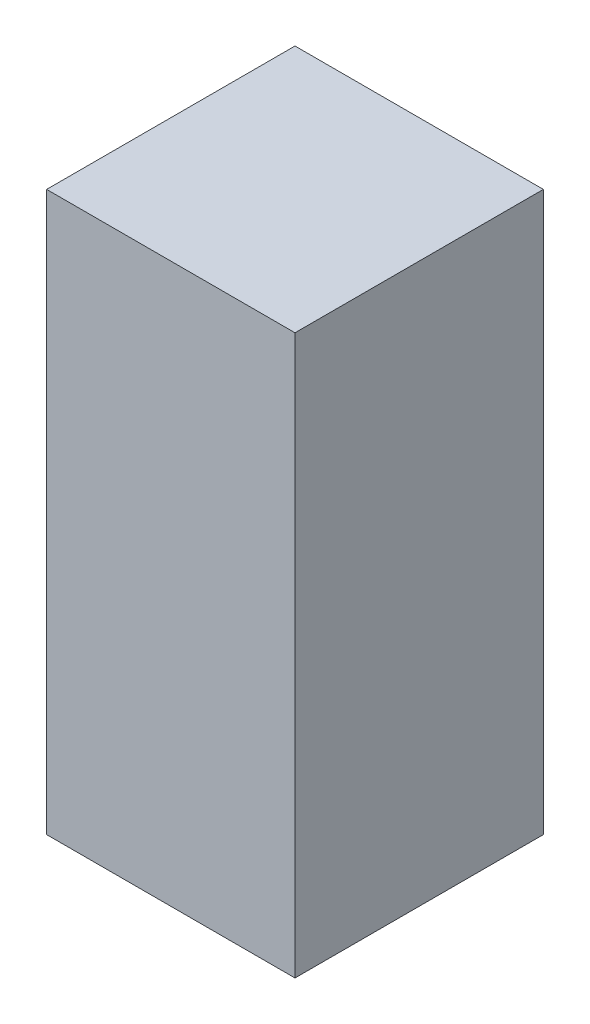
ISO-10303-21;
HEADER;
FILE_DESCRIPTION(('STEP AP214'),'2;1');
FILE_NAME('part.step','',(''),(''),'','','');
FILE_SCHEMA(('AUTOMOTIVE_DESIGN { 1 0 10303 214 1 1 1 1 }'));
ENDSEC;
DATA;
#1=APPLICATION_CONTEXT('core data for automotive mechanical design processes');
#2=APPLICATION_PROTOCOL_DEFINITION('international standard','automotive_design',2000,#1);
#3=PRODUCT_CONTEXT('',#1,'mechanical');
#4=PRODUCT('Part','Part','',(#3));
#5=PRODUCT_RELATED_PRODUCT_CATEGORY('part','',(#4));
#6=PRODUCT_DEFINITION_FORMATION('','',#4);
#7=PRODUCT_DEFINITION_CONTEXT('part definition',#1,'design');
#8=PRODUCT_DEFINITION('design','',#6,#7);
#9=PRODUCT_DEFINITION_SHAPE('','',#8);
#10=(LENGTH_UNIT() NAMED_UNIT(*) SI_UNIT(.MILLI.,.METRE.));
#11=(NAMED_UNIT(*) PLANE_ANGLE_UNIT() SI_UNIT($,.RADIAN.));
#12=(NAMED_UNIT(*) SI_UNIT($,.STERADIAN.) SOLID_ANGLE_UNIT());
#13=UNCERTAINTY_MEASURE_WITH_UNIT(LENGTH_MEASURE(1.E-05),#10,'distance_accuracy_value','');
#14=(GEOMETRIC_REPRESENTATION_CONTEXT(3) GLOBAL_UNCERTAINTY_ASSIGNED_CONTEXT((#13)) GLOBAL_UNIT_ASSIGNED_CONTEXT((#10,
#11,#12)) REPRESENTATION_CONTEXT('',''));
#15=CARTESIAN_POINT('',(0.,0.,0.));
#16=DIRECTION('',(0.,0.,1.));
#17=DIRECTION('',(1.,0.,0.));
#18=AXIS2_PLACEMENT_3D('',#15,#16,#17);
#19=CARTESIAN_POINT('',(177.5,552.,-572.5));
#20=DIRECTION('',(-1.,0.,0.));
#21=DIRECTION('',(0.,0.,1.));
#22=AXIS2_PLACEMENT_3D('',#19,#20,#21);
#23=PLANE('',#22);
#24=DIRECTION('',(0.,-1.,0.));
#25=VECTOR('',#24,1.);
#26=CARTESIAN_POINT('',(177.5,552.,-552.5));
#27=LINE('',#26,#25);
#28=CARTESIAN_POINT('',(177.5,597.,-552.5));
#29=VERTEX_POINT('',#28);
#30=CARTESIAN_POINT('',(177.5,552.,-552.5));
#31=VERTEX_POINT('',#30);
#32=EDGE_CURVE('E103',#29,#31,#27,.T.);
#33=ORIENTED_EDGE('',*,*,#32,.F.);
#34=DIRECTION('',(0.,0.,1.));
#35=VECTOR('',#34,1.);
#36=CARTESIAN_POINT('',(177.5,597.,-572.5));
#37=LINE('',#36,#35);
#38=CARTESIAN_POINT('',(177.5,597.,-572.5));
#39=VERTEX_POINT('',#38);
#40=EDGE_CURVE('E11',#39,#29,#37,.T.);
#41=ORIENTED_EDGE('',*,*,#40,.F.);
#42=DIRECTION('',(0.,-1.,0.));
#43=VECTOR('',#42,1.);
#44=CARTESIAN_POINT('',(177.5,552.,-572.5));
#45=LINE('',#44,#43);
#46=CARTESIAN_POINT('',(177.5,552.,-572.5));
#47=VERTEX_POINT('',#46);
#48=EDGE_CURVE('E97',#39,#47,#45,.T.);
#49=ORIENTED_EDGE('',*,*,#48,.T.);
#50=DIRECTION('',(0.,0.,1.));
#51=VECTOR('',#50,1.);
#52=CARTESIAN_POINT('',(177.5,552.,-572.5));
#53=LINE('',#52,#51);
#54=EDGE_CURVE('E42',#47,#31,#53,.T.);
#55=ORIENTED_EDGE('',*,*,#54,.T.);
#56=EDGE_LOOP('',(#33,#41,#49,#55));
#57=FACE_BOUND('',#56,.T.);
#58=ADVANCED_FACE('F39',(#57),#23,.T.);
#59=CARTESIAN_POINT('',(177.5,597.,-572.5));
#60=DIRECTION('',(0.,1.,0.));
#61=DIRECTION('',(0.,0.,1.));
#62=AXIS2_PLACEMENT_3D('',#59,#60,#61);
#63=PLANE('',#62);
#64=DIRECTION('',(-1.,0.,0.));
#65=VECTOR('',#64,1.);
#66=CARTESIAN_POINT('',(177.5,597.,-552.5));
#67=LINE('',#66,#65);
#68=CARTESIAN_POINT('',(197.5,597.,-552.5));
#69=VERTEX_POINT('',#68);
#70=EDGE_CURVE('E99',#69,#29,#67,.T.);
#71=ORIENTED_EDGE('',*,*,#70,.F.);
#72=DIRECTION('',(0.,0.,1.));
#73=VECTOR('',#72,1.);
#74=CARTESIAN_POINT('',(197.5,597.,-572.5));
#75=LINE('',#74,#73);
#76=CARTESIAN_POINT('',(197.5,597.,-572.5));
#77=VERTEX_POINT('',#76);
#78=EDGE_CURVE('E48',#77,#69,#75,.T.);
#79=ORIENTED_EDGE('',*,*,#78,.F.);
#80=DIRECTION('',(-1.,0.,0.));
#81=VECTOR('',#80,1.);
#82=CARTESIAN_POINT('',(177.5,597.,-572.5));
#83=LINE('',#82,#81);
#84=EDGE_CURVE('E94',#77,#39,#83,.T.);
#85=ORIENTED_EDGE('',*,*,#84,.T.);
#86=ORIENTED_EDGE('',*,*,#40,.T.);
#87=EDGE_LOOP('',(#71,#79,#85,#86));
#88=FACE_BOUND('',#87,.T.);
#89=ADVANCED_FACE('F113',(#88),#63,.T.);
#90=CARTESIAN_POINT('',(197.5,552.,-572.5));
#91=DIRECTION('',(1.,0.,0.));
#92=DIRECTION('',(0.,0.,-1.));
#93=AXIS2_PLACEMENT_3D('',#90,#91,#92);
#94=PLANE('',#93);
#95=DIRECTION('',(0.,1.,0.));
#96=VECTOR('',#95,1.);
#97=CARTESIAN_POINT('',(197.5,552.,-552.5));
#98=LINE('',#97,#96);
#99=CARTESIAN_POINT('',(197.5,552.,-552.5));
#100=VERTEX_POINT('',#99);
#101=EDGE_CURVE('E89',#100,#69,#98,.T.);
#102=ORIENTED_EDGE('',*,*,#101,.F.);
#103=DIRECTION('',(0.,0.,1.));
#104=VECTOR('',#103,1.);
#105=CARTESIAN_POINT('',(197.5,552.,-572.5));
#106=LINE('',#105,#104);
#107=CARTESIAN_POINT('',(197.5,552.,-572.5));
#108=VERTEX_POINT('',#107);
#109=EDGE_CURVE('E84',#108,#100,#106,.T.);
#110=ORIENTED_EDGE('',*,*,#109,.F.);
#111=DIRECTION('',(0.,1.,0.));
#112=VECTOR('',#111,1.);
#113=CARTESIAN_POINT('',(197.5,552.,-572.5));
#114=LINE('',#113,#112);
#115=EDGE_CURVE('E87',#108,#77,#114,.T.);
#116=ORIENTED_EDGE('',*,*,#115,.T.);
#117=ORIENTED_EDGE('',*,*,#78,.T.);
#118=EDGE_LOOP('',(#102,#110,#116,#117));
#119=FACE_BOUND('',#118,.T.);
#120=ADVANCED_FACE('F86',(#119),#94,.T.);
#121=CARTESIAN_POINT('',(177.5,552.,-572.5));
#122=DIRECTION('',(0.,-1.,0.));
#123=DIRECTION('',(0.,0.,-1.));
#124=AXIS2_PLACEMENT_3D('',#121,#122,#123);
#125=PLANE('',#124);
#126=DIRECTION('',(1.,0.,0.));
#127=VECTOR('',#126,1.);
#128=CARTESIAN_POINT('',(177.5,552.,-552.5));
#129=LINE('',#128,#127);
#130=EDGE_CURVE('E106',#31,#100,#129,.T.);
#131=ORIENTED_EDGE('',*,*,#130,.F.);
#132=ORIENTED_EDGE('',*,*,#54,.F.);
#133=DIRECTION('',(1.,0.,0.));
#134=VECTOR('',#133,1.);
#135=CARTESIAN_POINT('',(177.5,552.,-572.5));
#136=LINE('',#135,#134);
#137=EDGE_CURVE('E93',#47,#108,#136,.T.);
#138=ORIENTED_EDGE('',*,*,#137,.T.);
#139=ORIENTED_EDGE('',*,*,#109,.T.);
#140=EDGE_LOOP('',(#131,#132,#138,#139));
#141=FACE_BOUND('',#140,.T.);
#142=ADVANCED_FACE('F96',(#141),#125,.T.);
#143=CARTESIAN_POINT('',(0.,0.,-572.5));
#144=DIRECTION('',(0.,0.,-1.));
#145=DIRECTION('',(-1.,0.,0.));
#146=AXIS2_PLACEMENT_3D('',#143,#144,#145);
#147=PLANE('',#146);
#148=ORIENTED_EDGE('',*,*,#48,.F.);
#149=ORIENTED_EDGE('',*,*,#84,.F.);
#150=ORIENTED_EDGE('',*,*,#115,.F.);
#151=ORIENTED_EDGE('',*,*,#137,.F.);
#152=EDGE_LOOP('',(#148,#149,#150,#151));
#153=FACE_BOUND('',#152,.T.);
#154=ADVANCED_FACE('F92',(#153),#147,.T.);
#155=CARTESIAN_POINT('',(0.,0.,-552.5));
#156=DIRECTION('',(0.,0.,-1.));
#157=DIRECTION('',(-1.,0.,0.));
#158=AXIS2_PLACEMENT_3D('',#155,#156,#157);
#159=PLANE('',#158);
#160=ORIENTED_EDGE('',*,*,#32,.T.);
#161=ORIENTED_EDGE('',*,*,#130,.T.);
#162=ORIENTED_EDGE('',*,*,#101,.T.);
#163=ORIENTED_EDGE('',*,*,#70,.T.);
#164=EDGE_LOOP('',(#160,#161,#162,#163));
#165=FACE_BOUND('',#164,.T.);
#166=ADVANCED_FACE('F112',(#165),#159,.F.);
#167=CLOSED_SHELL('',(#58,#89,#120,#142,#154,#166));
#168=MANIFOLD_SOLID_BREP('B2',#167);
#169=ADVANCED_BREP_SHAPE_REPRESENTATION('',(#18,#168),#14);
#170=SHAPE_DEFINITION_REPRESENTATION(#9,#169);
ENDSEC;
END-ISO-10303-21;
